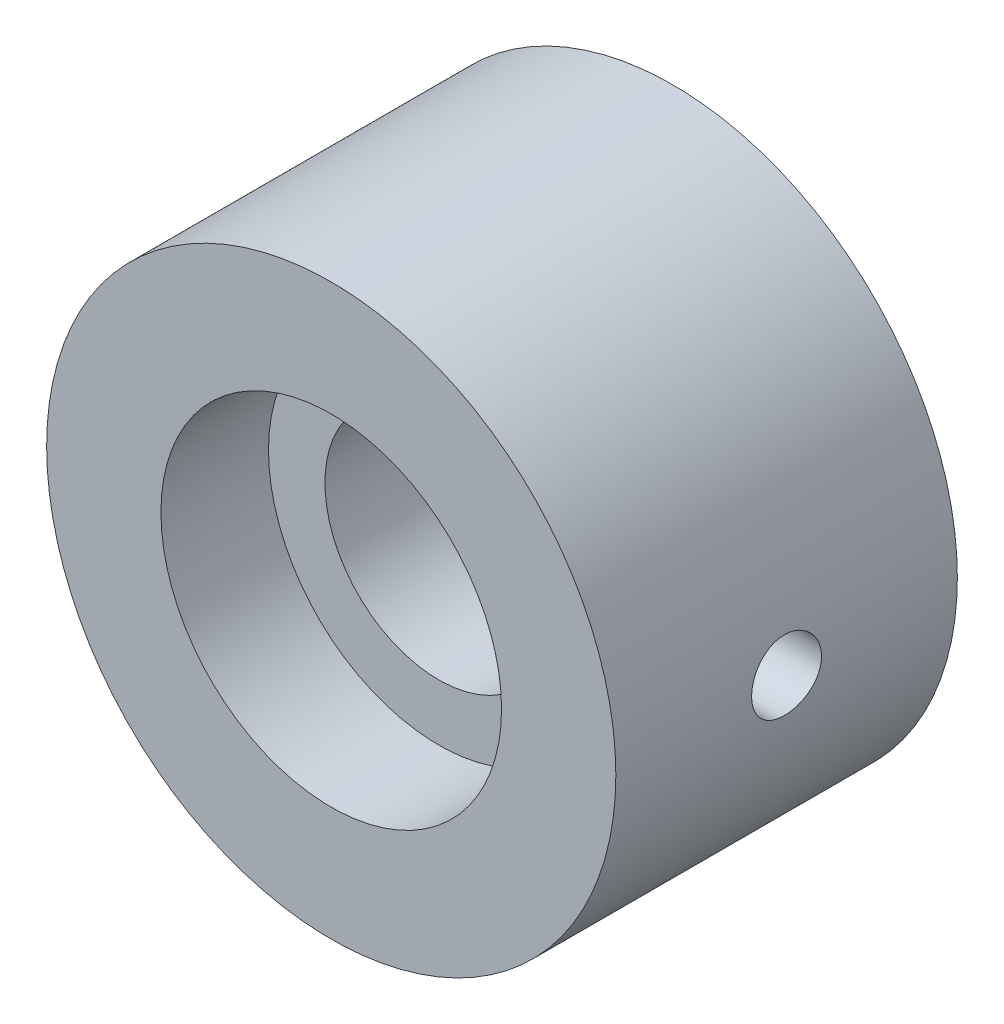
ISO-10303-21;
HEADER;
FILE_DESCRIPTION(('STEP AP214'),'2;1');
FILE_NAME('part.step','',(''),(''),'','','');
FILE_SCHEMA(('AUTOMOTIVE_DESIGN { 1 0 10303 214 1 1 1 1 }'));
ENDSEC;
DATA;
#1=APPLICATION_CONTEXT('core data for automotive mechanical design processes');
#2=APPLICATION_PROTOCOL_DEFINITION('international standard','automotive_design',2000,#1);
#3=PRODUCT_CONTEXT('',#1,'mechanical');
#4=PRODUCT('Part','Part','',(#3));
#5=PRODUCT_RELATED_PRODUCT_CATEGORY('part','',(#4));
#6=PRODUCT_DEFINITION_FORMATION('','',#4);
#7=PRODUCT_DEFINITION_CONTEXT('part definition',#1,'design');
#8=PRODUCT_DEFINITION('design','',#6,#7);
#9=PRODUCT_DEFINITION_SHAPE('','',#8);
#10=(LENGTH_UNIT() NAMED_UNIT(*) SI_UNIT(.MILLI.,.METRE.));
#11=(NAMED_UNIT(*) PLANE_ANGLE_UNIT() SI_UNIT($,.RADIAN.));
#12=(NAMED_UNIT(*) SI_UNIT($,.STERADIAN.) SOLID_ANGLE_UNIT());
#13=UNCERTAINTY_MEASURE_WITH_UNIT(LENGTH_MEASURE(1.E-05),#10,'distance_accuracy_value','');
#14=(GEOMETRIC_REPRESENTATION_CONTEXT(3) GLOBAL_UNCERTAINTY_ASSIGNED_CONTEXT((#13)) GLOBAL_UNIT_ASSIGNED_CONTEXT((#10,
#11,#12)) REPRESENTATION_CONTEXT('',''));
#15=CARTESIAN_POINT('',(0.,0.,0.));
#16=DIRECTION('',(0.,0.,1.));
#17=DIRECTION('',(1.,0.,0.));
#18=AXIS2_PLACEMENT_3D('',#15,#16,#17);
#19=CARTESIAN_POINT('',(0.,0.,-13.050000062));
#20=DIRECTION('',(0.,0.,1.));
#21=DIRECTION('',(1.,0.,0.));
#22=AXIS2_PLACEMENT_3D('',#19,#20,#21);
#23=PLANE('',#22);
#24=CARTESIAN_POINT('',(0.,0.,-13.050000062));
#25=DIRECTION('',(0.,0.,1.));
#26=DIRECTION('',(1.,0.,0.));
#27=AXIS2_PLACEMENT_3D('',#24,#25,#26);
#28=CIRCLE('',#27,15.875);
#29=CARTESIAN_POINT('',(15.875,0.,-13.050000062));
#30=VERTEX_POINT('',#29);
#31=EDGE_CURVE('E75',#30,#30,#28,.T.);
#32=ORIENTED_EDGE('',*,*,#31,.F.);
#33=EDGE_LOOP('',(#32));
#34=FACE_BOUND('',#33,.T.);
#35=CARTESIAN_POINT('',(0.,0.,-13.050000062));
#36=DIRECTION('',(0.,0.,1.));
#37=DIRECTION('',(1.,0.,0.));
#38=AXIS2_PLACEMENT_3D('',#35,#36,#37);
#39=CIRCLE('',#38,6.35);
#40=CARTESIAN_POINT('',(6.35,0.,-13.050000062));
#41=VERTEX_POINT('',#40);
#42=EDGE_CURVE('E80',#41,#41,#39,.T.);
#43=ORIENTED_EDGE('',*,*,#42,.T.);
#44=EDGE_LOOP('',(#43));
#45=FACE_BOUND('',#44,.T.);
#46=CARTESIAN_POINT('',(0.,-12.7,-13.050000062));
#47=DIRECTION('',(0.,0.,-1.));
#48=DIRECTION('',(-1.,0.,0.));
#49=AXIS2_PLACEMENT_3D('',#46,#47,#48);
#50=CIRCLE('',#49,1.95);
#51=CARTESIAN_POINT('',(-1.95,-12.7,-13.050000062));
#52=VERTEX_POINT('',#51);
#53=EDGE_CURVE('E109',#52,#52,#50,.F.);
#54=ORIENTED_EDGE('',*,*,#53,.T.);
#55=EDGE_LOOP('',(#54));
#56=FACE_BOUND('',#55,.T.);
#57=CARTESIAN_POINT('',(0.,12.7,-13.050000062));
#58=DIRECTION('',(0.,0.,-1.));
#59=DIRECTION('',(-1.,0.,0.));
#60=AXIS2_PLACEMENT_3D('',#57,#58,#59);
#61=CIRCLE('',#60,1.95);
#62=CARTESIAN_POINT('',(-1.95,12.7,-13.050000062));
#63=VERTEX_POINT('',#62);
#64=EDGE_CURVE('E91',#63,#63,#61,.T.);
#65=ORIENTED_EDGE('',*,*,#64,.F.);
#66=EDGE_LOOP('',(#65));
#67=FACE_BOUND('',#66,.T.);
#68=ADVANCED_FACE('F42',(#34,#45,#56,#67),#23,.F.);
#69=CARTESIAN_POINT('',(0.,0.,6.));
#70=DIRECTION('',(0.,0.,-1.));
#71=DIRECTION('',(-1.,0.,0.));
#72=AXIS2_PLACEMENT_3D('',#69,#70,#71);
#73=CYLINDRICAL_SURFACE('',#72,9.5);
#74=CARTESIAN_POINT('',(0.,0.,6.));
#75=DIRECTION('',(0.,0.,1.));
#76=DIRECTION('',(1.,0.,0.));
#77=AXIS2_PLACEMENT_3D('',#74,#75,#76);
#78=CIRCLE('',#77,9.5);
#79=CARTESIAN_POINT('',(9.5,0.,6.));
#80=VERTEX_POINT('',#79);
#81=EDGE_CURVE('E62',#80,#80,#78,.T.);
#82=ORIENTED_EDGE('',*,*,#81,.T.);
#83=EDGE_LOOP('',(#82));
#84=FACE_BOUND('',#83,.T.);
#85=CARTESIAN_POINT('',(0.,0.,0.));
#86=DIRECTION('',(0.,0.,1.));
#87=DIRECTION('',(1.,0.,0.));
#88=AXIS2_PLACEMENT_3D('',#85,#86,#87);
#89=CIRCLE('',#88,9.5);
#90=CARTESIAN_POINT('',(9.5,0.,0.));
#91=VERTEX_POINT('',#90);
#92=EDGE_CURVE('E70',#91,#91,#89,.T.);
#93=ORIENTED_EDGE('',*,*,#92,.F.);
#94=EDGE_LOOP('',(#93));
#95=FACE_BOUND('',#94,.T.);
#96=ADVANCED_FACE('F46',(#84,#95),#73,.F.);
#97=CARTESIAN_POINT('',(0.,0.,6.));
#98=DIRECTION('',(0.,0.,-1.));
#99=DIRECTION('',(-1.,0.,0.));
#100=AXIS2_PLACEMENT_3D('',#97,#98,#99);
#101=CYLINDRICAL_SURFACE('',#100,15.875);
#102=CARTESIAN_POINT('',(15.875,0.,-5.475000031));
#103=CARTESIAN_POINT('',(15.8749984996695,-0.109091635657177,-5.47499538704466));
#104=CARTESIAN_POINT('',(15.8738636145146,-0.218251818472943,-5.46581456533797));
#105=CARTESIAN_POINT('',(15.8694454930915,-0.433535697956955,-5.4293347878982));
#106=CARTESIAN_POINT('',(15.8661600018665,-0.539656085297117,-5.40201681454125));
#107=CARTESIAN_POINT('',(15.8578108676735,-0.745712449431408,-5.3300788112362));
#108=CARTESIAN_POINT('',(15.8527484101529,-0.84565249709462,-5.28547031405571));
#109=CARTESIAN_POINT('',(15.8414086787376,-1.03660848917392,-5.18024249626433));
#110=CARTESIAN_POINT('',(15.8351316164254,-1.12762598373223,-5.11962596356166));
#111=CARTESIAN_POINT('',(15.8220263564267,-1.29865705097452,-4.98375761455348));
#112=CARTESIAN_POINT('',(15.8151956818049,-1.37861628530336,-4.90843762918764));
#113=CARTESIAN_POINT('',(15.8017730760334,-1.52479318956466,-4.74544672772929));
#114=CARTESIAN_POINT('',(15.7951811569537,-1.59101016556668,-4.65777518830659));
#115=CARTESIAN_POINT('',(15.7829579712838,-1.70802443854119,-4.47221785479643));
#116=CARTESIAN_POINT('',(15.7773298929555,-1.7587709771967,-4.37429982391413));
#117=CARTESIAN_POINT('',(15.7677041311081,-1.84307971870168,-4.17125082717959));
#118=CARTESIAN_POINT('',(15.7637063878414,-1.87664255130086,-4.06612012581797));
#119=CARTESIAN_POINT('',(15.7578174905465,-1.92546638135259,-3.85219322849525));
#120=CARTESIAN_POINT('',(15.755915794494,-1.94081899669899,-3.74341823742189));
#121=CARTESIAN_POINT('',(15.7544020087318,-1.95307005739227,-3.52482030536539));
#122=CARTESIAN_POINT('',(15.7547898300032,-1.94996922022953,-3.41499740529185));
#123=CARTESIAN_POINT('',(15.7578016136163,-1.92547663300571,-3.19805896225664));
#124=CARTESIAN_POINT('',(15.760413248052,-1.90418571907383,-3.09093183933696));
#125=CARTESIAN_POINT('',(15.7675591624959,-1.84407463713728,-2.88178260497178));
#126=CARTESIAN_POINT('',(15.7720934802344,-1.80525412513567,-2.7797605937515));
#127=CARTESIAN_POINT('',(15.7825878564819,-1.71107715813541,-2.58340385296519));
#128=CARTESIAN_POINT('',(15.7885516921479,-1.65567679683265,-2.4890903919214));
#129=CARTESIAN_POINT('',(15.8012301856438,-1.52994416648238,-2.31106099112575));
#130=CARTESIAN_POINT('',(15.8079448766355,-1.45961123780799,-2.22734551978724));
#131=CARTESIAN_POINT('',(15.8214233193507,-1.30545071422877,-2.07230312440676));
#132=CARTESIAN_POINT('',(15.8281870994146,-1.22153618770746,-2.00106261148573));
#133=CARTESIAN_POINT('',(15.8409596477729,-1.04289405190826,-1.8736649126185));
#134=CARTESIAN_POINT('',(15.8469684144266,-0.948166419132862,-1.8175077594502));
#135=CARTESIAN_POINT('',(15.8575574594906,-0.750521045852014,-1.72187114710528));
#136=CARTESIAN_POINT('',(15.8621372827191,-0.647600708684001,-1.68239700078903));
#137=CARTESIAN_POINT('',(15.8693482491345,-0.436523797186397,-1.62131502424889));
#138=CARTESIAN_POINT('',(15.8719794803991,-0.328367459763014,-1.59970638648679));
#139=CARTESIAN_POINT('',(15.8749853589123,-0.110635972316937,-1.57508058656937));
#140=CARTESIAN_POINT('',(15.8753744564066,-0.00107447921691545,-1.5719443692791));
#141=CARTESIAN_POINT('',(15.873891216281,0.21701253776651,-1.58403838987204));
#142=CARTESIAN_POINT('',(15.8720189251303,0.325538082891355,-1.59926825035188));
#143=CARTESIAN_POINT('',(15.8662323078876,0.538121998648206,-1.64756321459314));
#144=CARTESIAN_POINT('',(15.8623244714587,0.642193435241011,-1.68057164856199));
#145=CARTESIAN_POINT('',(15.8529043559146,0.84332345473797,-1.7634279184777));
#146=CARTESIAN_POINT('',(15.847392024031,0.940381806866221,-1.81327630826213));
#147=CARTESIAN_POINT('',(15.8353416402011,1.12526286090958,-1.92868620845237));
#148=CARTESIAN_POINT('',(15.8287986097111,1.2130370868871,-1.99432484625716));
#149=CARTESIAN_POINT('',(15.8154345942434,1.37636534239346,-2.13934274853309));
#150=CARTESIAN_POINT('',(15.8086135986326,1.45191890389514,-2.21872253902216));
#151=CARTESIAN_POINT('',(15.7954179414587,1.58908269179694,-2.38949341181263));
#152=CARTESIAN_POINT('',(15.7890459365447,1.65061407254503,-2.48094805833327));
#153=CARTESIAN_POINT('',(15.7775131259806,1.75744240658827,-2.67296365259593));
#154=CARTESIAN_POINT('',(15.7723522967571,1.80273967586086,-2.77352442305049));
#155=CARTESIAN_POINT('',(15.7638441327051,1.87568590074765,-2.98064179227574));
#156=CARTESIAN_POINT('',(15.7604922092417,1.90337954340526,-3.08718245586343));
#157=CARTESIAN_POINT('',(15.7559681160791,1.94047640951428,-3.30344562211588));
#158=CARTESIAN_POINT('',(15.7547958487364,1.94988045229903,-3.41316798202422));
#159=CARTESIAN_POINT('',(15.7547665705131,1.95011649139227,-3.63189559618495));
#160=CARTESIAN_POINT('',(15.7558941179715,1.94107235440365,-3.74090073547582));
#161=CARTESIAN_POINT('',(15.7603042506726,1.90493081878887,-3.95582924835795));
#162=CARTESIAN_POINT('',(15.7635868363882,1.87783341620049,-4.06175262127284));
#163=CARTESIAN_POINT('',(15.7719324520006,1.80639285509962,-4.26749596335794));
#164=CARTESIAN_POINT('',(15.7769948881996,1.76205544674672,-4.36731795472482));
#165=CARTESIAN_POINT('',(15.7883307988697,1.65740566380039,-4.55812491191506));
#166=CARTESIAN_POINT('',(15.7946042864518,1.59709311625676,-4.64910978205133));
#167=CARTESIAN_POINT('',(15.8077059122498,1.46174491951955,-4.82029317423718));
#168=CARTESIAN_POINT('',(15.8145373629613,1.38661693345281,-4.90041844031918));
#169=CARTESIAN_POINT('',(15.8279558236688,1.22396249026511,-5.0469727020189));
#170=CARTESIAN_POINT('',(15.8345427755717,1.13643311006129,-5.11339845948993));
#171=CARTESIAN_POINT('',(15.8467566948266,0.951092682343061,-5.23087485434762));
#172=CARTESIAN_POINT('',(15.8523800441809,0.853245021387954,-5.28186807384329));
#173=CARTESIAN_POINT('',(15.8619963033509,0.650361636736409,-5.36662709861046));
#174=CARTESIAN_POINT('',(15.8659909902084,0.545333894213928,-5.40041169039573));
#175=CARTESIAN_POINT('',(15.8709329735242,0.366464810953699,-5.44167522859677));
#176=CARTESIAN_POINT('',(15.8724507087471,0.29375298727725,-5.45415415421192));
#177=CARTESIAN_POINT('',(15.8744847252684,0.147371200054018,-5.4708180949596));
#178=CARTESIAN_POINT('',(15.8750010136086,0.073701243248073,-5.47500316841086));
#179=CARTESIAN_POINT('',(15.875,0.,-5.475000031));
#180=B_SPLINE_CURVE_WITH_KNOTS('',3,(#102,#103,#104,#105,#106,#107,#108,#109,#110,#111,#112,
#113,#114,#115,#116,#117,#118,#119,#120,#121,#122,#123,#124,#125,#126,#127,#128,#129,#130,#131,
#132,#133,#134,#135,#136,#137,#138,#139,#140,#141,#142,#143,#144,#145,#146,#147,#148,#149,#150,
#151,#152,#153,#154,#155,#156,#157,#158,#159,#160,#161,#162,#163,#164,#165,#166,#167,#168,#169,
#170,#171,#172,#173,#174,#175,#176,#177,#178,#179),.UNSPECIFIED.,.T.,.F.,(4,2,2,2,2,2,2,2,2,2,2,
2,2,2,2,2,2,2,2,2,2,2,2,2,2,2,2,2,2,2,2,2,2,2,2,2,2,2,4),(0.,0.327005707130551,
0.654354837194614,0.981486000299123,1.30856022881588,1.63718850480973,1.96583337121433,
2.29554519184131,2.62524492830033,2.95327877138885,3.2812998602467,3.60751428578232,
3.93373511315536,4.26082759112558,4.58793452099078,4.9172245886302,5.2465153718495,
5.57591094194032,5.90529162221993,6.23254709400879,6.55979584116036,6.88600759251478,
7.21223007346468,7.54007955036915,7.86794158028564,8.1976040066352,8.5272600161543,
8.85607581187646,9.18487687704403,9.51147753939166,9.83807827341948,10.1645701677125,
10.4910655968194,10.8196641592899,11.1483403036608,11.4782246892999,11.8077481669054,
12.0286715813092,12.2495934422709),.UNSPECIFIED.);
#181=CARTESIAN_POINT('',(15.875,0.,-5.475000031));
#182=VERTEX_POINT('',#181);
#183=EDGE_CURVE('E10',#182,#182,#180,.T.);
#184=ORIENTED_EDGE('',*,*,#183,.T.);
#185=EDGE_LOOP('',(#184));
#186=FACE_BOUND('',#185,.T.);
#187=CARTESIAN_POINT('',(0.,0.,6.));
#188=DIRECTION('',(0.,0.,1.));
#189=DIRECTION('',(1.,0.,0.));
#190=AXIS2_PLACEMENT_3D('',#187,#188,#189);
#191=CIRCLE('',#190,15.875);
#192=CARTESIAN_POINT('',(15.875,0.,6.));
#193=VERTEX_POINT('',#192);
#194=EDGE_CURVE('E57',#193,#193,#191,.T.);
#195=ORIENTED_EDGE('',*,*,#194,.F.);
#196=EDGE_LOOP('',(#195));
#197=FACE_BOUND('',#196,.T.);
#198=ORIENTED_EDGE('',*,*,#31,.T.);
#199=EDGE_LOOP('',(#198));
#200=FACE_BOUND('',#199,.T.);
#201=ADVANCED_FACE('F143',(#186,#197,#200),#101,.T.);
#202=CARTESIAN_POINT('',(0.,0.,6.));
#203=DIRECTION('',(0.,0.,1.));
#204=DIRECTION('',(1.,0.,0.));
#205=AXIS2_PLACEMENT_3D('',#202,#203,#204);
#206=PLANE('',#205);
#207=ORIENTED_EDGE('',*,*,#81,.F.);
#208=EDGE_LOOP('',(#207));
#209=FACE_BOUND('',#208,.T.);
#210=ORIENTED_EDGE('',*,*,#194,.T.);
#211=EDGE_LOOP('',(#210));
#212=FACE_BOUND('',#211,.T.);
#213=ADVANCED_FACE('F155',(#209,#212),#206,.T.);
#214=CARTESIAN_POINT('',(0.,0.,0.));
#215=DIRECTION('',(0.,0.,1.));
#216=DIRECTION('',(1.,0.,0.));
#217=AXIS2_PLACEMENT_3D('',#214,#215,#216);
#218=PLANE('',#217);
#219=CARTESIAN_POINT('',(0.,0.,0.));
#220=DIRECTION('',(0.,0.,1.));
#221=DIRECTION('',(1.,0.,0.));
#222=AXIS2_PLACEMENT_3D('',#219,#220,#221);
#223=CIRCLE('',#222,6.35);
#224=CARTESIAN_POINT('',(6.35,0.,0.));
#225=VERTEX_POINT('',#224);
#226=EDGE_CURVE('E83',#225,#225,#223,.T.);
#227=ORIENTED_EDGE('',*,*,#226,.F.);
#228=EDGE_LOOP('',(#227));
#229=FACE_BOUND('',#228,.T.);
#230=ORIENTED_EDGE('',*,*,#92,.T.);
#231=EDGE_LOOP('',(#230));
#232=FACE_BOUND('',#231,.T.);
#233=ADVANCED_FACE('F146',(#229,#232),#218,.T.);
#234=CARTESIAN_POINT('',(0.,0.,-13.050000062));
#235=DIRECTION('',(0.,0.,1.));
#236=DIRECTION('',(1.,0.,0.));
#237=AXIS2_PLACEMENT_3D('',#234,#235,#236);
#238=CYLINDRICAL_SURFACE('',#237,6.35);
#239=CARTESIAN_POINT('',(6.35,0.,-13.050000062));
#240=CARTESIAN_POINT('',(6.35,0.,-12.9140625613542));
#241=CARTESIAN_POINT('',(6.35,0.,-12.7781250607083));
#242=CARTESIAN_POINT('',(6.35,0.,-12.5062500594167));
#243=CARTESIAN_POINT('',(6.35,0.,-12.3703125587708));
#244=CARTESIAN_POINT('',(6.35,0.,-12.0984375574792));
#245=CARTESIAN_POINT('',(6.35,0.,-11.9625000568333));
#246=CARTESIAN_POINT('',(6.35,0.,-11.6906250555417));
#247=CARTESIAN_POINT('',(6.35,0.,-11.5546875548958));
#248=CARTESIAN_POINT('',(6.35,0.,-11.2828125536042));
#249=CARTESIAN_POINT('',(6.35,0.,-11.1468750529583));
#250=CARTESIAN_POINT('',(6.35,0.,-10.8750000516667));
#251=CARTESIAN_POINT('',(6.35,0.,-10.7390625510208));
#252=CARTESIAN_POINT('',(6.35,0.,-10.4671875497292));
#253=CARTESIAN_POINT('',(6.35,0.,-10.3312500490833));
#254=CARTESIAN_POINT('',(6.35,0.,-10.0593750477917));
#255=CARTESIAN_POINT('',(6.35,0.,-9.92343754714583));
#256=CARTESIAN_POINT('',(6.35,0.,-9.65156254585417));
#257=CARTESIAN_POINT('',(6.35,0.,-9.51562504520833));
#258=CARTESIAN_POINT('',(6.35,0.,-9.24375004391667));
#259=CARTESIAN_POINT('',(6.35,0.,-9.10781254327083));
#260=CARTESIAN_POINT('',(6.35,0.,-8.83593754197917));
#261=CARTESIAN_POINT('',(6.35,0.,-8.70000004133333));
#262=CARTESIAN_POINT('',(6.35,0.,-8.42812504004167));
#263=CARTESIAN_POINT('',(6.35,0.,-8.29218753939583));
#264=CARTESIAN_POINT('',(6.35,0.,-8.02031253810417));
#265=CARTESIAN_POINT('',(6.35,0.,-7.88437503745833));
#266=CARTESIAN_POINT('',(6.35,0.,-7.61250003616667));
#267=CARTESIAN_POINT('',(6.35,0.,-7.47656253552083));
#268=CARTESIAN_POINT('',(6.35,0.,-7.20468753422917));
#269=CARTESIAN_POINT('',(6.35,0.,-7.06875003358333));
#270=CARTESIAN_POINT('',(6.35,0.,-6.79687503229167));
#271=CARTESIAN_POINT('',(6.35,0.,-6.66093753164583));
#272=CARTESIAN_POINT('',(6.35,0.,-6.38906253035417));
#273=CARTESIAN_POINT('',(6.35,0.,-6.25312502970833));
#274=CARTESIAN_POINT('',(6.35,0.,-5.98125002841667));
#275=CARTESIAN_POINT('',(6.35,0.,-5.84531252777083));
#276=CARTESIAN_POINT('',(6.35,0.,-5.57343752647917));
#277=CARTESIAN_POINT('',(6.35,0.,-5.43750002583333));
#278=CARTESIAN_POINT('',(6.35,0.,-5.16562502454167));
#279=CARTESIAN_POINT('',(6.35,0.,-5.02968752389583));
#280=CARTESIAN_POINT('',(6.35,0.,-4.75781252260417));
#281=CARTESIAN_POINT('',(6.35,0.,-4.62187502195833));
#282=CARTESIAN_POINT('',(6.35,0.,-4.35000002066667));
#283=CARTESIAN_POINT('',(6.35,0.,-4.21406252002083));
#284=CARTESIAN_POINT('',(6.35,0.,-3.94218751872917));
#285=CARTESIAN_POINT('',(6.35,0.,-3.80625001808333));
#286=CARTESIAN_POINT('',(6.35,0.,-3.53437501679167));
#287=CARTESIAN_POINT('',(6.35,0.,-3.39843751614583));
#288=CARTESIAN_POINT('',(6.35,0.,-3.12656251485417));
#289=CARTESIAN_POINT('',(6.35,0.,-2.99062501420833));
#290=CARTESIAN_POINT('',(6.35,0.,-2.71875001291667));
#291=CARTESIAN_POINT('',(6.35,0.,-2.58281251227083));
#292=CARTESIAN_POINT('',(6.35,0.,-2.31093751097917));
#293=CARTESIAN_POINT('',(6.35,0.,-2.17500001033333));
#294=CARTESIAN_POINT('',(6.35,0.,-1.90312500904167));
#295=CARTESIAN_POINT('',(6.35,0.,-1.76718750839583));
#296=CARTESIAN_POINT('',(6.35,0.,-1.49531250710417));
#297=CARTESIAN_POINT('',(6.35,0.,-1.35937500645833));
#298=CARTESIAN_POINT('',(6.35,0.,-1.08750000516667));
#299=CARTESIAN_POINT('',(6.35,0.,-0.951562504520833));
#300=CARTESIAN_POINT('',(6.35,0.,-0.679687503229167));
#301=CARTESIAN_POINT('',(6.35,0.,-0.543750002583334));
#302=CARTESIAN_POINT('',(6.35,0.,-0.271875001291667));
#303=CARTESIAN_POINT('',(6.35,0.,-0.135937500645833));
#304=CARTESIAN_POINT('',(6.35,0.,0.));
#305=B_SPLINE_CURVE_WITH_KNOTS('',3,(#239,#240,#241,#242,#243,#244,#245,#246,#247,#248,#249,
#250,#251,#252,#253,#254,#255,#256,#257,#258,#259,#260,#261,#262,#263,#264,#265,#266,#267,#268,
#269,#270,#271,#272,#273,#274,#275,#276,#277,#278,#279,#280,#281,#282,#283,#284,#285,#286,#287,
#288,#289,#290,#291,#292,#293,#294,#295,#296,#297,#298,#299,#300,#301,#302,#303,#304),
.UNSPECIFIED.,.F.,.F.,(4,2,2,2,2,2,2,2,2,2,2,2,2,2,2,2,2,2,2,2,2,2,2,2,2,2,2,2,2,2,2,2,4),(0.,
0.407812501937499,0.815625003875,1.2234375058125,1.63125000775,2.0390625096875,2.446875011625,
2.8546875135625,3.2625000155,3.6703125174375,4.078125019375,4.4859375213125,4.89375002325,
5.3015625251875,5.709375027125,6.1171875290625,6.525000031,6.9328125329375,7.340625034875,
7.7484375368125,8.15625003875,8.5640625406875,8.971875042625,9.3796875445625,9.7875000465,
10.1953125484375,10.603125050375,11.0109375523125,11.41875005425,11.8265625561875,
12.234375058125,12.6421875600625,13.050000062),.UNSPECIFIED.);
#306=EDGE_CURVE('BSEAM151',#41,#225,#305,.T.);
#307=ORIENTED_EDGE('',*,*,#42,.F.);
#308=ORIENTED_EDGE('',*,*,#226,.T.);
#309=ORIENTED_EDGE('',*,*,#306,.T.);
#310=ORIENTED_EDGE('',*,*,#306,.F.);
#311=EDGE_LOOP('',(#307,#309,#308,#310));
#312=FACE_BOUND('',#311,.T.);
#313=ADVANCED_FACE('F151',(#312),#238,.F.);
#314=CARTESIAN_POINT('',(0.,-12.7,-2.890000062));
#315=DIRECTION('',(0.,0.,-1.));
#316=DIRECTION('',(-1.,0.,0.));
#317=AXIS2_PLACEMENT_3D('',#314,#315,#316);
#318=CYLINDRICAL_SURFACE('',#317,1.95);
#319=CARTESIAN_POINT('',(0.,-12.7,-2.890000062));
#320=DIRECTION('',(0.,0.,-1.));
#321=DIRECTION('',(-1.,0.,0.));
#322=AXIS2_PLACEMENT_3D('',#319,#320,#321);
#323=CIRCLE('',#322,1.95);
#324=CARTESIAN_POINT('',(-1.95,-12.7,-2.890000062));
#325=VERTEX_POINT('',#324);
#326=EDGE_CURVE('E97',#325,#325,#323,.F.);
#327=ORIENTED_EDGE('',*,*,#326,.T.);
#328=EDGE_LOOP('',(#327));
#329=FACE_BOUND('',#328,.T.);
#330=ORIENTED_EDGE('',*,*,#53,.F.);
#331=EDGE_LOOP('',(#330));
#332=FACE_BOUND('',#331,.T.);
#333=ADVANCED_FACE('F148',(#329,#332),#318,.F.);
#334=CARTESIAN_POINT('',(0.,0.,-2.890000062));
#335=DIRECTION('',(0.,0.,-1.));
#336=DIRECTION('',(-1.,0.,0.));
#337=AXIS2_PLACEMENT_3D('',#334,#335,#336);
#338=PLANE('',#337);
#339=ORIENTED_EDGE('',*,*,#326,.F.);
#340=EDGE_LOOP('',(#339));
#341=FACE_BOUND('',#340,.T.);
#342=ADVANCED_FACE('F177',(#341),#338,.T.);
#343=CARTESIAN_POINT('',(0.,12.7,-2.890000062));
#344=DIRECTION('',(0.,0.,-1.));
#345=DIRECTION('',(-1.,0.,0.));
#346=AXIS2_PLACEMENT_3D('',#343,#344,#345);
#347=CYLINDRICAL_SURFACE('',#346,1.95);
#348=CARTESIAN_POINT('',(0.,12.7,-2.890000062));
#349=DIRECTION('',(0.,0.,-1.));
#350=DIRECTION('',(-1.,0.,0.));
#351=AXIS2_PLACEMENT_3D('',#348,#349,#350);
#352=CIRCLE('',#351,1.95);
#353=CARTESIAN_POINT('',(-1.95,12.7,-2.890000062));
#354=VERTEX_POINT('',#353);
#355=EDGE_CURVE('E86',#354,#354,#352,.T.);
#356=ORIENTED_EDGE('',*,*,#355,.F.);
#357=EDGE_LOOP('',(#356));
#358=FACE_BOUND('',#357,.T.);
#359=ORIENTED_EDGE('',*,*,#64,.T.);
#360=EDGE_LOOP('',(#359));
#361=FACE_BOUND('',#360,.T.);
#362=ADVANCED_FACE('F128',(#358,#361),#347,.F.);
#363=CARTESIAN_POINT('',(0.,0.,-2.890000062));
#364=DIRECTION('',(0.,0.,-1.));
#365=DIRECTION('',(-1.,0.,0.));
#366=AXIS2_PLACEMENT_3D('',#363,#364,#365);
#367=PLANE('',#366);
#368=ORIENTED_EDGE('',*,*,#355,.T.);
#369=EDGE_LOOP('',(#368));
#370=FACE_BOUND('',#369,.T.);
#371=ADVANCED_FACE('F124',(#370),#367,.T.);
#372=CARTESIAN_POINT('',(-15.876,0.,-3.525000031));
#373=DIRECTION('',(1.,0.,0.));
#374=DIRECTION('',(0.,0.,-1.));
#375=AXIS2_PLACEMENT_3D('',#372,#373,#374);
#376=CYLINDRICAL_SURFACE('',#375,1.95);
#377=CARTESIAN_POINT('',(9.5,0.,-5.475000031));
#378=CARTESIAN_POINT('',(9.49999799697423,0.108314223113156,-5.47499611969894));
#379=CARTESIAN_POINT('',(9.49812862222731,0.216677281066787,-5.46594495110215));
#380=CARTESIAN_POINT('',(9.49085169392001,0.430336315675729,-5.43001057452979));
#381=CARTESIAN_POINT('',(9.48544140652025,0.535629856778206,-5.40311358807749));
#382=CARTESIAN_POINT('',(9.47168631551041,0.740030181003274,-5.33235679438086));
#383=CARTESIAN_POINT('',(9.46334439326747,0.839142926725772,-5.28851363852729));
#384=CARTESIAN_POINT('',(9.44463109692803,1.02859979144516,-5.18515947129857));
#385=CARTESIAN_POINT('',(9.43425982487908,1.11894435101601,-5.12564924770305));
#386=CARTESIAN_POINT('',(9.4124628581198,1.28959162895947,-4.99175302170784));
#387=CARTESIAN_POINT('',(9.40102540702056,1.36975165097526,-4.91718705296416));
#388=CARTESIAN_POINT('',(9.37846994162571,1.51651833956621,-4.75568272404331));
#389=CARTESIAN_POINT('',(9.36735195326625,1.58312390835322,-4.66874336270146));
#390=CARTESIAN_POINT('',(9.34657914699526,1.70150443513856,-4.48392588515496));
#391=CARTESIAN_POINT('',(9.33693943942595,1.75313050359211,-4.38595055219506));
#392=CARTESIAN_POINT('',(9.32038210795461,1.83913238956087,-4.18248531917143));
#393=CARTESIAN_POINT('',(9.31346419992166,1.87351000775938,-4.07699620483615));
#394=CARTESIAN_POINT('',(9.30325291140069,1.92357360219351,-3.86303665894287));
#395=CARTESIAN_POINT('',(9.29991090759262,1.93951057463613,-3.75462732559549));
#396=CARTESIAN_POINT('',(9.29708355915176,1.95302033039028,-3.53662603476099));
#397=CARTESIAN_POINT('',(9.29759779863842,1.95059509399295,-3.4270342060742));
#398=CARTESIAN_POINT('',(9.30238069885732,1.92765195018338,-3.21162317214093));
#399=CARTESIAN_POINT('',(9.30658943399709,1.90742281261903,-3.10577168052025));
#400=CARTESIAN_POINT('',(9.31819264532868,1.84990236872131,-2.89899755441443));
#401=CARTESIAN_POINT('',(9.32558728095796,1.81261020846811,-2.79807516688635));
#402=CARTESIAN_POINT('',(9.34278976649078,1.72174947383416,-2.6031974372864));
#403=CARTESIAN_POINT('',(9.35261435381734,1.66806737804827,-2.50929656273564));
#404=CARTESIAN_POINT('',(9.37355914732053,1.54603063048216,-2.33172772025046));
#405=CARTESIAN_POINT('',(9.38467950991908,1.47767420642248,-2.24806099025381));
#406=CARTESIAN_POINT('',(9.40722180532371,1.32668784434562,-2.09167015525081));
#407=CARTESIAN_POINT('',(9.41864545663187,1.24381168795967,-2.01918379898387));
#408=CARTESIAN_POINT('',(9.44031425043662,1.06695415264708,-1.88910315869095));
#409=CARTESIAN_POINT('',(9.45055937623196,0.972972616380897,-1.83150908569373));
#410=CARTESIAN_POINT('',(9.46874404839211,0.776300922435043,-1.73279992367569));
#411=CARTESIAN_POINT('',(9.47667963467631,0.673596192325587,-1.69171309365473));
#412=CARTESIAN_POINT('',(9.48932123645482,0.46254242666166,-1.6274440288241));
#413=CARTESIAN_POINT('',(9.49402766443189,0.354194113904171,-1.60425950718104));
#414=CARTESIAN_POINT('',(9.49962287233101,0.136970834094247,-1.57679228306909));
#415=CARTESIAN_POINT('',(9.5005773257951,0.0281386277986156,-1.57218438339948));
#416=CARTESIAN_POINT('',(9.49874389963518,-0.188740536503753,-1.58112387309788));
#417=CARTESIAN_POINT('',(9.49595624213776,-0.296787540736263,-1.59467018485667));
#418=CARTESIAN_POINT('',(9.48699300941231,-0.507972399154695,-1.63926351781803));
#419=CARTESIAN_POINT('',(9.4808499469383,-0.61114720201537,-1.67014266775827));
#420=CARTESIAN_POINT('',(9.46586248620229,-0.810854197183377,-1.74834090370255));
#421=CARTESIAN_POINT('',(9.45701787765485,-0.90738587167977,-1.79566126951263));
#422=CARTESIAN_POINT('',(9.43744521552582,-1.09243064013866,-1.90609510237881));
#423=CARTESIAN_POINT('',(9.42669449186991,-1.18082521038122,-1.96940306565396));
#424=CARTESIAN_POINT('',(9.40455341060712,-1.34585293325109,-2.10975577556991));
#425=CARTESIAN_POINT('',(9.3931629805973,-1.42248475087291,-2.18680207929226));
#426=CARTESIAN_POINT('',(9.37080338119749,-1.56307517270957,-2.35392818523936));
#427=CARTESIAN_POINT('',(9.35984394123852,-1.62680997779749,-2.44419778358531));
#428=CARTESIAN_POINT('',(9.33979819054215,-1.73821367034523,-2.63435208944498));
#429=CARTESIAN_POINT('',(9.33071180288916,-1.78588321756481,-2.73423640188992));
#430=CARTESIAN_POINT('',(9.31552053973352,-1.86350294376718,-2.94027065124116));
#431=CARTESIAN_POINT('',(9.30939982639581,-1.89354743297824,-3.04638383445353));
#432=CARTESIAN_POINT('',(9.30080063672581,-1.93534780707989,-3.26229224865708));
#433=CARTESIAN_POINT('',(9.29832165666629,-1.94710622132706,-3.37208696826612));
#434=CARTESIAN_POINT('',(9.29731562169946,-1.95190317797183,-3.58999232098242));
#435=CARTESIAN_POINT('',(9.29871384423937,-1.94529566782131,-3.6980949713239));
#436=CARTESIAN_POINT('',(9.305137161833,-1.91433226425633,-3.91161235875291));
#437=CARTESIAN_POINT('',(9.31016222423485,-1.88997653062628,-4.01702712003022));
#438=CARTESIAN_POINT('',(9.32323877914401,-1.82436959079349,-4.22193591965364));
#439=CARTESIAN_POINT('',(9.33128209494609,-1.78316400545017,-4.32144512063135));
#440=CARTESIAN_POINT('',(9.34949312053924,-1.68506859343538,-4.51219241589061));
#441=CARTESIAN_POINT('',(9.35966102046713,-1.62817736285232,-4.60342976884555));
#442=CARTESIAN_POINT('',(9.38120270767347,-1.49912621090053,-4.77680118610842));
#443=CARTESIAN_POINT('',(9.39259479886012,-1.42671157899539,-4.85874341443748));
#444=CARTESIAN_POINT('',(9.41517224177811,-1.26919252524218,-5.00943000298271));
#445=CARTESIAN_POINT('',(9.4263575453508,-1.18408518821882,-5.07817132298392));
#446=CARTESIAN_POINT('',(9.44740819458996,-1.00245720250462,-5.20123021294294));
#447=CARTESIAN_POINT('',(9.45725746294594,-0.905820062979772,-5.25537872522119));
#448=CARTESIAN_POINT('',(9.47436732116779,-0.7046404634267,-5.3465809260149));
#449=CARTESIAN_POINT('',(9.48163019923489,-0.600105090797168,-5.38364973366506));
#450=CARTESIAN_POINT('',(9.49136908661218,-0.412807462848193,-5.43261593559847));
#451=CARTESIAN_POINT('',(9.49458644043781,-0.331097764948226,-5.44848110219687));
#452=CARTESIAN_POINT('',(9.49890262887879,-0.166268271221863,-5.46967446677334));
#453=CARTESIAN_POINT('',(9.50000153764329,-0.0831485248522822,-5.47500303355039));
#454=CARTESIAN_POINT('',(9.5,0.,-5.475000031));
#455=B_SPLINE_CURVE_WITH_KNOTS('',3,(#377,#378,#379,#380,#381,#382,#383,#384,#385,#386,#387,
#388,#389,#390,#391,#392,#393,#394,#395,#396,#397,#398,#399,#400,#401,#402,#403,#404,#405,#406,
#407,#408,#409,#410,#411,#412,#413,#414,#415,#416,#417,#418,#419,#420,#421,#422,#423,#424,#425,
#426,#427,#428,#429,#430,#431,#432,#433,#434,#435,#436,#437,#438,#439,#440,#441,#442,#443,#444,
#445,#446,#447,#448,#449,#450,#451,#452,#453,#454),.UNSPECIFIED.,.T.,.F.,(4,2,2,2,2,2,2,2,2,2,2,
2,2,2,2,2,2,2,2,2,2,2,2,2,2,2,2,2,2,2,2,2,2,2,2,2,2,2,4),(0.,0.324638440376948,0.64952782114185,
0.974098772230862,1.29865340619075,1.62734548720466,1.95606417871966,2.28794626811058,
2.61979370285506,2.94706915347206,3.27430930923715,3.59633764308093,3.91838209461189,
4.24270976430898,4.56707662646272,4.89759807806199,5.22812421300676,5.55921379401779,
5.89026107478408,6.2154872897518,6.54069420059042,6.86280446772079,7.1849398139608,
7.51120064644488,7.83749848034138,8.16904748215915,8.50058286643302,8.83032765740104,
9.16002683353041,9.48341634923359,9.80680295354888,10.1293197277138,10.4518653774588,
10.7801755638044,11.1085612706842,11.4406020315107,11.7723482989741,12.021569052352,
12.2707810824239),.UNSPECIFIED.);
#456=CARTESIAN_POINT('',(9.5,0.,-5.475000031));
#457=VERTEX_POINT('',#456);
#458=EDGE_CURVE('E105',#457,#457,#455,.T.);
#459=ORIENTED_EDGE('',*,*,#458,.F.);
#460=EDGE_LOOP('',(#459));
#461=FACE_BOUND('',#460,.T.);
#462=ORIENTED_EDGE('',*,*,#183,.F.);
#463=EDGE_LOOP('',(#462));
#464=FACE_BOUND('',#463,.T.);
#465=ADVANCED_FACE('F122',(#461,#464),#376,.F.);
#466=CARTESIAN_POINT('',(0.,0.,6.));
#467=DIRECTION('',(0.,0.,-1.));
#468=DIRECTION('',(-1.,0.,0.));
#469=AXIS2_PLACEMENT_3D('',#466,#467,#468);
#470=CYLINDRICAL_SURFACE('',#469,9.5);
#471=ORIENTED_EDGE('',*,*,#458,.T.);
#472=EDGE_LOOP('',(#471));
#473=FACE_BOUND('',#472,.T.);
#474=ADVANCED_FACE('F116',(#473),#470,.T.);
#475=CLOSED_SHELL('',(#68,#96,#201,#213,#233,#313,#333,#342,#362,#371,#465,#474));
#476=MANIFOLD_SOLID_BREP('B2',#475);
#477=ADVANCED_BREP_SHAPE_REPRESENTATION('',(#18,#476),#14);
#478=SHAPE_DEFINITION_REPRESENTATION(#9,#477);
ENDSEC;
END-ISO-10303-21;
